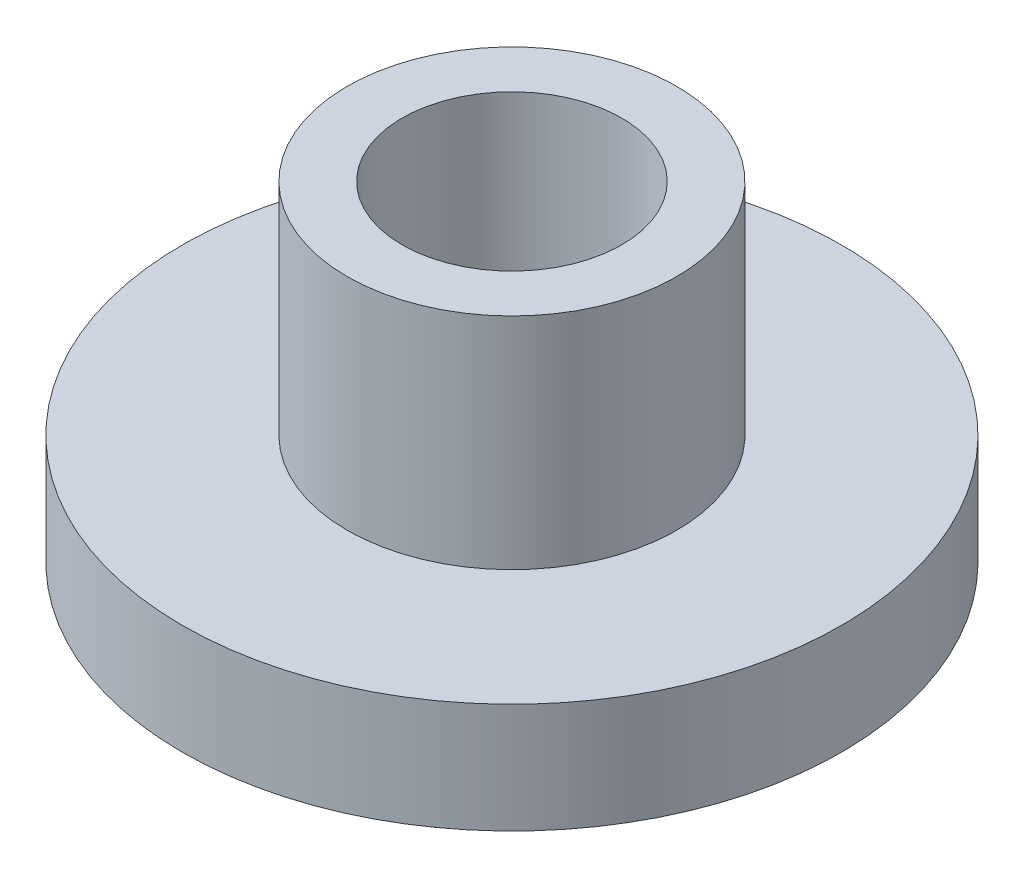
ISO-10303-21;
HEADER;
FILE_DESCRIPTION(('STEP AP214'),'2;1');
FILE_NAME('part.step','',(''),(''),'','','');
FILE_SCHEMA(('AUTOMOTIVE_DESIGN { 1 0 10303 214 1 1 1 1 }'));
ENDSEC;
DATA;
#1=APPLICATION_CONTEXT('core data for automotive mechanical design processes');
#2=APPLICATION_PROTOCOL_DEFINITION('international standard','automotive_design',2000,#1);
#3=PRODUCT_CONTEXT('',#1,'mechanical');
#4=PRODUCT('Part','Part','',(#3));
#5=PRODUCT_RELATED_PRODUCT_CATEGORY('part','',(#4));
#6=PRODUCT_DEFINITION_FORMATION('','',#4);
#7=PRODUCT_DEFINITION_CONTEXT('part definition',#1,'design');
#8=PRODUCT_DEFINITION('design','',#6,#7);
#9=PRODUCT_DEFINITION_SHAPE('','',#8);
#10=(LENGTH_UNIT() NAMED_UNIT(*) SI_UNIT(.MILLI.,.METRE.));
#11=(NAMED_UNIT(*) PLANE_ANGLE_UNIT() SI_UNIT($,.RADIAN.));
#12=(NAMED_UNIT(*) SI_UNIT($,.STERADIAN.) SOLID_ANGLE_UNIT());
#13=UNCERTAINTY_MEASURE_WITH_UNIT(LENGTH_MEASURE(1.E-05),#10,'distance_accuracy_value','');
#14=(GEOMETRIC_REPRESENTATION_CONTEXT(3) GLOBAL_UNCERTAINTY_ASSIGNED_CONTEXT((#13)) GLOBAL_UNIT_ASSIGNED_CONTEXT((#10,
#11,#12)) REPRESENTATION_CONTEXT('',''));
#15=CARTESIAN_POINT('',(0.,0.,0.));
#16=DIRECTION('',(0.,0.,1.));
#17=DIRECTION('',(1.,0.,0.));
#18=AXIS2_PLACEMENT_3D('',#15,#16,#17);
#19=CARTESIAN_POINT('',(0.,12.7,0.));
#20=DIRECTION('',(0.,1.,0.));
#21=DIRECTION('',(0.,0.,1.));
#22=AXIS2_PLACEMENT_3D('',#19,#20,#21);
#23=PLANE('',#22);
#24=CARTESIAN_POINT('',(0.,12.7,0.));
#25=DIRECTION('',(0.,1.,0.));
#26=DIRECTION('',(0.,0.,1.));
#27=AXIS2_PLACEMENT_3D('',#24,#25,#26);
#28=CIRCLE('',#27,38.1);
#29=CARTESIAN_POINT('',(0.,12.7,38.1));
#30=VERTEX_POINT('',#29);
#31=EDGE_CURVE('E10',#30,#30,#28,.T.);
#32=ORIENTED_EDGE('',*,*,#31,.T.);
#33=EDGE_LOOP('',(#32));
#34=FACE_BOUND('',#33,.T.);
#35=CARTESIAN_POINT('',(0.,12.7,0.));
#36=DIRECTION('',(0.,1.,0.));
#37=DIRECTION('',(0.,0.,1.));
#38=AXIS2_PLACEMENT_3D('',#35,#36,#37);
#39=CIRCLE('',#38,19.05);
#40=CARTESIAN_POINT('',(0.,12.7,19.05));
#41=VERTEX_POINT('',#40);
#42=EDGE_CURVE('E40',#41,#41,#39,.T.);
#43=ORIENTED_EDGE('',*,*,#42,.F.);
#44=EDGE_LOOP('',(#43));
#45=FACE_BOUND('',#44,.T.);
#46=ADVANCED_FACE('F25',(#34,#45),#23,.T.);
#47=CARTESIAN_POINT('',(0.,12.7,0.));
#48=DIRECTION('',(0.,-1.,0.));
#49=DIRECTION('',(0.,0.,-1.));
#50=AXIS2_PLACEMENT_3D('',#47,#48,#49);
#51=CYLINDRICAL_SURFACE('',#50,38.1);
#52=ORIENTED_EDGE('',*,*,#31,.F.);
#53=EDGE_LOOP('',(#52));
#54=FACE_BOUND('',#53,.T.);
#55=CARTESIAN_POINT('',(0.,0.,0.));
#56=DIRECTION('',(0.,1.,0.));
#57=DIRECTION('',(0.,0.,1.));
#58=AXIS2_PLACEMENT_3D('',#55,#56,#57);
#59=CIRCLE('',#58,38.1);
#60=CARTESIAN_POINT('',(0.,0.,38.1));
#61=VERTEX_POINT('',#60);
#62=EDGE_CURVE('E32',#61,#61,#59,.T.);
#63=ORIENTED_EDGE('',*,*,#62,.T.);
#64=EDGE_LOOP('',(#63));
#65=FACE_BOUND('',#64,.T.);
#66=ADVANCED_FACE('F27',(#54,#65),#51,.T.);
#67=CARTESIAN_POINT('',(0.,0.,0.));
#68=DIRECTION('',(0.,1.,0.));
#69=DIRECTION('',(0.,0.,1.));
#70=AXIS2_PLACEMENT_3D('',#67,#68,#69);
#71=PLANE('',#70);
#72=CARTESIAN_POINT('',(0.,0.,0.));
#73=DIRECTION('',(0.,1.,0.));
#74=DIRECTION('',(0.,0.,1.));
#75=AXIS2_PLACEMENT_3D('',#72,#73,#74);
#76=CIRCLE('',#75,12.7);
#77=CARTESIAN_POINT('',(0.,0.,12.7));
#78=VERTEX_POINT('',#77);
#79=EDGE_CURVE('E45',#78,#78,#76,.T.);
#80=ORIENTED_EDGE('',*,*,#79,.T.);
#81=EDGE_LOOP('',(#80));
#82=FACE_BOUND('',#81,.T.);
#83=ORIENTED_EDGE('',*,*,#62,.F.);
#84=EDGE_LOOP('',(#83));
#85=FACE_BOUND('',#84,.T.);
#86=ADVANCED_FACE('F63',(#82,#85),#71,.F.);
#87=CARTESIAN_POINT('',(0.,38.1,0.));
#88=DIRECTION('',(0.,-1.,0.));
#89=DIRECTION('',(0.,0.,-1.));
#90=AXIS2_PLACEMENT_3D('',#87,#88,#89);
#91=CYLINDRICAL_SURFACE('',#90,19.05);
#92=CARTESIAN_POINT('',(0.,38.1,0.));
#93=DIRECTION('',(0.,1.,0.));
#94=DIRECTION('',(0.,0.,1.));
#95=AXIS2_PLACEMENT_3D('',#92,#93,#94);
#96=CIRCLE('',#95,19.05);
#97=CARTESIAN_POINT('',(0.,38.1,19.05));
#98=VERTEX_POINT('',#97);
#99=EDGE_CURVE('E36',#98,#98,#96,.T.);
#100=ORIENTED_EDGE('',*,*,#99,.F.);
#101=EDGE_LOOP('',(#100));
#102=FACE_BOUND('',#101,.T.);
#103=ORIENTED_EDGE('',*,*,#42,.T.);
#104=EDGE_LOOP('',(#103));
#105=FACE_BOUND('',#104,.T.);
#106=ADVANCED_FACE('F57',(#102,#105),#91,.T.);
#107=CARTESIAN_POINT('',(0.,38.1,0.));
#108=DIRECTION('',(0.,1.,0.));
#109=DIRECTION('',(0.,0.,1.));
#110=AXIS2_PLACEMENT_3D('',#107,#108,#109);
#111=PLANE('',#110);
#112=CARTESIAN_POINT('',(0.,38.1,0.));
#113=DIRECTION('',(0.,1.,0.));
#114=DIRECTION('',(0.,0.,1.));
#115=AXIS2_PLACEMENT_3D('',#112,#113,#114);
#116=CIRCLE('',#115,12.7);
#117=CARTESIAN_POINT('',(0.,38.1,12.7));
#118=VERTEX_POINT('',#117);
#119=EDGE_CURVE('E48',#118,#118,#116,.T.);
#120=ORIENTED_EDGE('',*,*,#119,.F.);
#121=EDGE_LOOP('',(#120));
#122=FACE_BOUND('',#121,.T.);
#123=ORIENTED_EDGE('',*,*,#99,.T.);
#124=EDGE_LOOP('',(#123));
#125=FACE_BOUND('',#124,.T.);
#126=ADVANCED_FACE('F54',(#122,#125),#111,.T.);
#127=CARTESIAN_POINT('',(0.,0.,0.));
#128=DIRECTION('',(0.,1.,0.));
#129=DIRECTION('',(0.,0.,1.));
#130=AXIS2_PLACEMENT_3D('',#127,#128,#129);
#131=CYLINDRICAL_SURFACE('',#130,12.7);
#132=ORIENTED_EDGE('',*,*,#79,.F.);
#133=EDGE_LOOP('',(#132));
#134=FACE_BOUND('',#133,.T.);
#135=ORIENTED_EDGE('',*,*,#119,.T.);
#136=EDGE_LOOP('',(#135));
#137=FACE_BOUND('',#136,.T.);
#138=ADVANCED_FACE('F52',(#134,#137),#131,.F.);
#139=CLOSED_SHELL('',(#46,#66,#86,#106,#126,#138));
#140=MANIFOLD_SOLID_BREP('B2',#139);
#141=ADVANCED_BREP_SHAPE_REPRESENTATION('',(#18,#140),#14);
#142=SHAPE_DEFINITION_REPRESENTATION(#9,#141);
ENDSEC;
END-ISO-10303-21;
